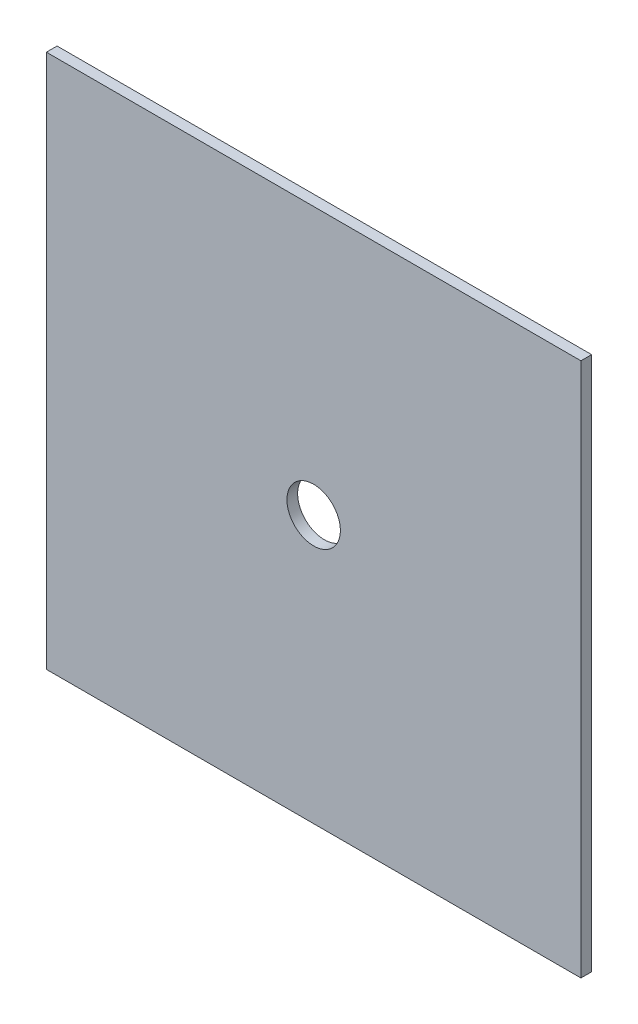
ISO-10303-21;
HEADER;
FILE_DESCRIPTION(('STEP AP214'),'2;1');
FILE_NAME('part.step','',(''),(''),'','','');
FILE_SCHEMA(('AUTOMOTIVE_DESIGN { 1 0 10303 214 1 1 1 1 }'));
ENDSEC;
DATA;
#1=APPLICATION_CONTEXT('core data for automotive mechanical design processes');
#2=APPLICATION_PROTOCOL_DEFINITION('international standard','automotive_design',2000,#1);
#3=PRODUCT_CONTEXT('',#1,'mechanical');
#4=PRODUCT('Part','Part','',(#3));
#5=PRODUCT_RELATED_PRODUCT_CATEGORY('part','',(#4));
#6=PRODUCT_DEFINITION_FORMATION('','',#4);
#7=PRODUCT_DEFINITION_CONTEXT('part definition',#1,'design');
#8=PRODUCT_DEFINITION('design','',#6,#7);
#9=PRODUCT_DEFINITION_SHAPE('','',#8);
#10=(LENGTH_UNIT() NAMED_UNIT(*) SI_UNIT(.MILLI.,.METRE.));
#11=(NAMED_UNIT(*) PLANE_ANGLE_UNIT() SI_UNIT($,.RADIAN.));
#12=(NAMED_UNIT(*) SI_UNIT($,.STERADIAN.) SOLID_ANGLE_UNIT());
#13=UNCERTAINTY_MEASURE_WITH_UNIT(LENGTH_MEASURE(1.E-05),#10,'distance_accuracy_value','');
#14=(GEOMETRIC_REPRESENTATION_CONTEXT(3) GLOBAL_UNCERTAINTY_ASSIGNED_CONTEXT((#13)) GLOBAL_UNIT_ASSIGNED_CONTEXT((#10,
#11,#12)) REPRESENTATION_CONTEXT('',''));
#15=CARTESIAN_POINT('',(0.,0.,0.));
#16=DIRECTION('',(0.,0.,1.));
#17=DIRECTION('',(1.,0.,0.));
#18=AXIS2_PLACEMENT_3D('',#15,#16,#17);
#19=CARTESIAN_POINT('',(50.,50.,2.));
#20=DIRECTION('',(-1.,0.,0.));
#21=DIRECTION('',(0.,-1.,0.));
#22=AXIS2_PLACEMENT_3D('',#19,#20,#21);
#23=PLANE('',#22);
#24=DIRECTION('',(0.,1.,0.));
#25=VECTOR('',#24,1.);
#26=CARTESIAN_POINT('',(50.,50.,0.));
#27=LINE('',#26,#25);
#28=CARTESIAN_POINT('',(50.,-50.,0.));
#29=VERTEX_POINT('',#28);
#30=CARTESIAN_POINT('',(50.,50.,0.));
#31=VERTEX_POINT('',#30);
#32=EDGE_CURVE('E111',#29,#31,#27,.T.);
#33=ORIENTED_EDGE('',*,*,#32,.T.);
#34=DIRECTION('',(0.,0.,-1.));
#35=VECTOR('',#34,1.);
#36=CARTESIAN_POINT('',(50.,50.,2.));
#37=LINE('',#36,#35);
#38=CARTESIAN_POINT('',(50.,50.,2.));
#39=VERTEX_POINT('',#38);
#40=EDGE_CURVE('E11',#39,#31,#37,.T.);
#41=ORIENTED_EDGE('',*,*,#40,.F.);
#42=DIRECTION('',(0.,1.,0.));
#43=VECTOR('',#42,1.);
#44=CARTESIAN_POINT('',(50.,50.,2.));
#45=LINE('',#44,#43);
#46=CARTESIAN_POINT('',(50.,-50.,2.));
#47=VERTEX_POINT('',#46);
#48=EDGE_CURVE('E95',#47,#39,#45,.T.);
#49=ORIENTED_EDGE('',*,*,#48,.F.);
#50=DIRECTION('',(0.,0.,-1.));
#51=VECTOR('',#50,1.);
#52=CARTESIAN_POINT('',(50.,-50.,2.));
#53=LINE('',#52,#51);
#54=EDGE_CURVE('E107',#47,#29,#53,.T.);
#55=ORIENTED_EDGE('',*,*,#54,.T.);
#56=EDGE_LOOP('',(#33,#41,#49,#55));
#57=FACE_BOUND('',#56,.T.);
#58=ADVANCED_FACE('F43',(#57),#23,.F.);
#59=CARTESIAN_POINT('',(-50.,50.,2.));
#60=DIRECTION('',(0.,-1.,0.));
#61=DIRECTION('',(0.,0.,-1.));
#62=AXIS2_PLACEMENT_3D('',#59,#60,#61);
#63=PLANE('',#62);
#64=DIRECTION('',(-1.,0.,0.));
#65=VECTOR('',#64,1.);
#66=CARTESIAN_POINT('',(-50.,50.,0.));
#67=LINE('',#66,#65);
#68=CARTESIAN_POINT('',(-50.,50.,0.));
#69=VERTEX_POINT('',#68);
#70=EDGE_CURVE('E100',#31,#69,#67,.T.);
#71=ORIENTED_EDGE('',*,*,#70,.T.);
#72=DIRECTION('',(0.,0.,-1.));
#73=VECTOR('',#72,1.);
#74=CARTESIAN_POINT('',(-50.,50.,2.));
#75=LINE('',#74,#73);
#76=CARTESIAN_POINT('',(-50.,50.,2.));
#77=VERTEX_POINT('',#76);
#78=EDGE_CURVE('E52',#77,#69,#75,.T.);
#79=ORIENTED_EDGE('',*,*,#78,.F.);
#80=DIRECTION('',(-1.,0.,0.));
#81=VECTOR('',#80,1.);
#82=CARTESIAN_POINT('',(-50.,50.,2.));
#83=LINE('',#82,#81);
#84=EDGE_CURVE('E90',#39,#77,#83,.T.);
#85=ORIENTED_EDGE('',*,*,#84,.F.);
#86=ORIENTED_EDGE('',*,*,#40,.T.);
#87=EDGE_LOOP('',(#71,#79,#85,#86));
#88=FACE_BOUND('',#87,.T.);
#89=ADVANCED_FACE('F99',(#88),#63,.F.);
#90=CARTESIAN_POINT('',(-50.,50.,2.));
#91=DIRECTION('',(1.,0.,0.));
#92=DIRECTION('',(0.,1.,0.));
#93=AXIS2_PLACEMENT_3D('',#90,#91,#92);
#94=PLANE('',#93);
#95=DIRECTION('',(0.,-1.,0.));
#96=VECTOR('',#95,1.);
#97=CARTESIAN_POINT('',(-50.,50.,0.));
#98=LINE('',#97,#96);
#99=CARTESIAN_POINT('',(-50.,-50.,0.));
#100=VERTEX_POINT('',#99);
#101=EDGE_CURVE('E77',#69,#100,#98,.T.);
#102=ORIENTED_EDGE('',*,*,#101,.T.);
#103=DIRECTION('',(0.,0.,-1.));
#104=VECTOR('',#103,1.);
#105=CARTESIAN_POINT('',(-50.,-50.,2.));
#106=LINE('',#105,#104);
#107=CARTESIAN_POINT('',(-50.,-50.,2.));
#108=VERTEX_POINT('',#107);
#109=EDGE_CURVE('E102',#108,#100,#106,.T.);
#110=ORIENTED_EDGE('',*,*,#109,.F.);
#111=DIRECTION('',(0.,-1.,0.));
#112=VECTOR('',#111,1.);
#113=CARTESIAN_POINT('',(-50.,50.,2.));
#114=LINE('',#113,#112);
#115=EDGE_CURVE('E93',#77,#108,#114,.T.);
#116=ORIENTED_EDGE('',*,*,#115,.F.);
#117=ORIENTED_EDGE('',*,*,#78,.T.);
#118=EDGE_LOOP('',(#102,#110,#116,#117));
#119=FACE_BOUND('',#118,.T.);
#120=ADVANCED_FACE('F103',(#119),#94,.F.);
#121=CARTESIAN_POINT('',(-50.,-50.,2.));
#122=DIRECTION('',(0.,1.,0.));
#123=DIRECTION('',(0.,0.,1.));
#124=AXIS2_PLACEMENT_3D('',#121,#122,#123);
#125=PLANE('',#124);
#126=DIRECTION('',(1.,0.,0.));
#127=VECTOR('',#126,1.);
#128=CARTESIAN_POINT('',(-50.,-50.,0.));
#129=LINE('',#128,#127);
#130=EDGE_CURVE('E83',#100,#29,#129,.T.);
#131=ORIENTED_EDGE('',*,*,#130,.T.);
#132=ORIENTED_EDGE('',*,*,#54,.F.);
#133=DIRECTION('',(1.,0.,0.));
#134=VECTOR('',#133,1.);
#135=CARTESIAN_POINT('',(-50.,-50.,2.));
#136=LINE('',#135,#134);
#137=EDGE_CURVE('E60',#108,#47,#136,.T.);
#138=ORIENTED_EDGE('',*,*,#137,.F.);
#139=ORIENTED_EDGE('',*,*,#109,.T.);
#140=EDGE_LOOP('',(#131,#132,#138,#139));
#141=FACE_BOUND('',#140,.T.);
#142=ADVANCED_FACE('F125',(#141),#125,.F.);
#143=CARTESIAN_POINT('',(0.,0.,2.));
#144=DIRECTION('',(0.,0.,1.));
#145=DIRECTION('',(1.,0.,0.));
#146=AXIS2_PLACEMENT_3D('',#143,#144,#145);
#147=PLANE('',#146);
#148=CARTESIAN_POINT('',(0.,0.,2.));
#149=DIRECTION('',(0.,0.,1.));
#150=DIRECTION('',(1.,0.,0.));
#151=AXIS2_PLACEMENT_3D('',#148,#149,#150);
#152=CIRCLE('',#151,5.);
#153=CARTESIAN_POINT('',(5.,0.,2.));
#154=VERTEX_POINT('',#153);
#155=EDGE_CURVE('E132',#154,#154,#152,.T.);
#156=ORIENTED_EDGE('',*,*,#155,.F.);
#157=EDGE_LOOP('',(#156));
#158=FACE_BOUND('',#157,.T.);
#159=ORIENTED_EDGE('',*,*,#48,.T.);
#160=ORIENTED_EDGE('',*,*,#84,.T.);
#161=ORIENTED_EDGE('',*,*,#115,.T.);
#162=ORIENTED_EDGE('',*,*,#137,.T.);
#163=EDGE_LOOP('',(#159,#160,#161,#162));
#164=FACE_BOUND('',#163,.T.);
#165=ADVANCED_FACE('F91',(#158,#164),#147,.T.);
#166=CARTESIAN_POINT('',(0.,0.,0.));
#167=DIRECTION('',(0.,0.,1.));
#168=DIRECTION('',(1.,0.,0.));
#169=AXIS2_PLACEMENT_3D('',#166,#167,#168);
#170=PLANE('',#169);
#171=CARTESIAN_POINT('',(0.,0.,0.));
#172=DIRECTION('',(0.,0.,1.));
#173=DIRECTION('',(1.,0.,0.));
#174=AXIS2_PLACEMENT_3D('',#171,#172,#173);
#175=CIRCLE('',#174,5.);
#176=CARTESIAN_POINT('',(5.,0.,0.));
#177=VERTEX_POINT('',#176);
#178=EDGE_CURVE('E115',#177,#177,#175,.T.);
#179=ORIENTED_EDGE('',*,*,#178,.T.);
#180=EDGE_LOOP('',(#179));
#181=FACE_BOUND('',#180,.T.);
#182=ORIENTED_EDGE('',*,*,#32,.F.);
#183=ORIENTED_EDGE('',*,*,#130,.F.);
#184=ORIENTED_EDGE('',*,*,#101,.F.);
#185=ORIENTED_EDGE('',*,*,#70,.F.);
#186=EDGE_LOOP('',(#182,#183,#184,#185));
#187=FACE_BOUND('',#186,.T.);
#188=ADVANCED_FACE('F128',(#181,#187),#170,.F.);
#189=CARTESIAN_POINT('',(0.,0.,0.));
#190=DIRECTION('',(0.,0.,1.));
#191=DIRECTION('',(1.,0.,0.));
#192=AXIS2_PLACEMENT_3D('',#189,#190,#191);
#193=CYLINDRICAL_SURFACE('',#192,5.);
#194=ORIENTED_EDGE('',*,*,#178,.F.);
#195=EDGE_LOOP('',(#194));
#196=FACE_BOUND('',#195,.T.);
#197=ORIENTED_EDGE('',*,*,#155,.T.);
#198=EDGE_LOOP('',(#197));
#199=FACE_BOUND('',#198,.T.);
#200=ADVANCED_FACE('F141',(#196,#199),#193,.F.);
#201=CLOSED_SHELL('',(#58,#89,#120,#142,#165,#188,#200));
#202=MANIFOLD_SOLID_BREP('B2',#201);
#203=ADVANCED_BREP_SHAPE_REPRESENTATION('',(#18,#202),#14);
#204=SHAPE_DEFINITION_REPRESENTATION(#9,#203);
ENDSEC;
END-ISO-10303-21;
